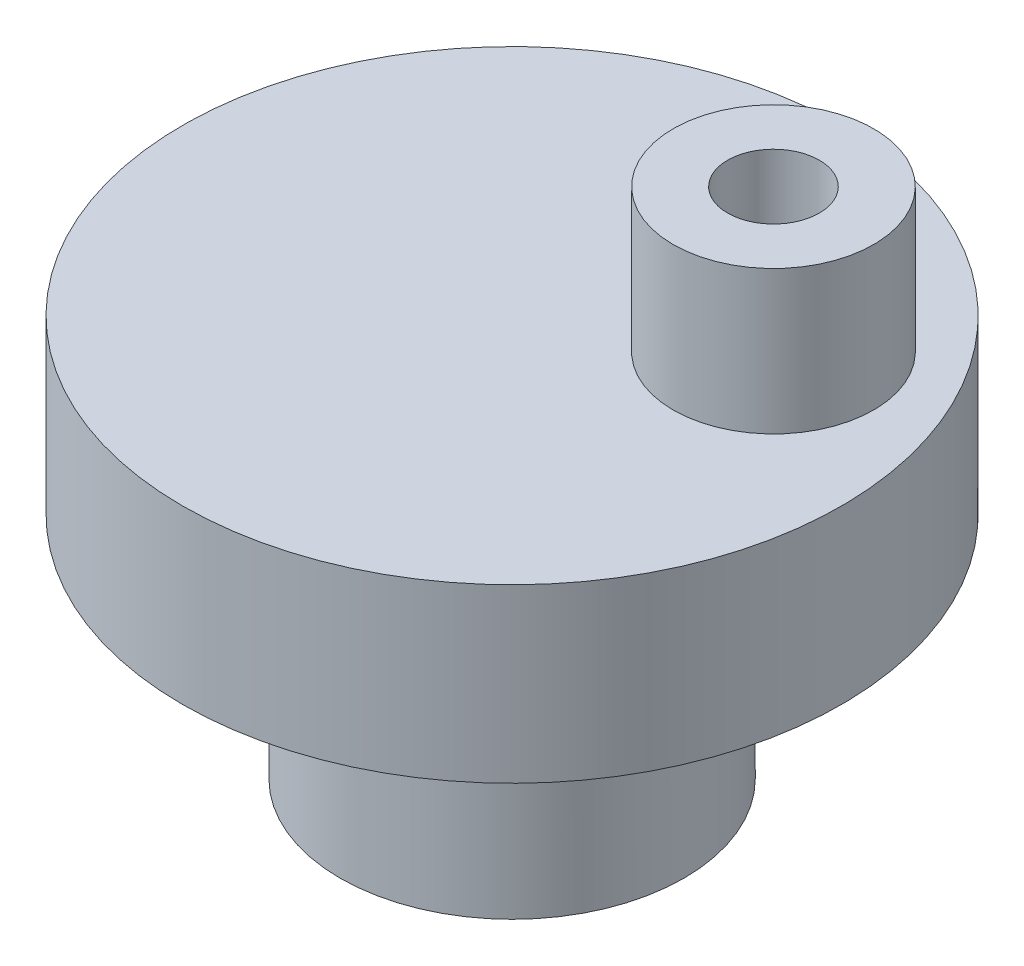
ISO-10303-21;
HEADER;
FILE_DESCRIPTION(('STEP AP214'),'2;1');
FILE_NAME('part.step','',(''),(''),'','','');
FILE_SCHEMA(('AUTOMOTIVE_DESIGN { 1 0 10303 214 1 1 1 1 }'));
ENDSEC;
DATA;
#1=APPLICATION_CONTEXT('core data for automotive mechanical design processes');
#2=APPLICATION_PROTOCOL_DEFINITION('international standard','automotive_design',2000,#1);
#3=PRODUCT_CONTEXT('',#1,'mechanical');
#4=PRODUCT('Part','Part','',(#3));
#5=PRODUCT_RELATED_PRODUCT_CATEGORY('part','',(#4));
#6=PRODUCT_DEFINITION_FORMATION('','',#4);
#7=PRODUCT_DEFINITION_CONTEXT('part definition',#1,'design');
#8=PRODUCT_DEFINITION('design','',#6,#7);
#9=PRODUCT_DEFINITION_SHAPE('','',#8);
#10=(LENGTH_UNIT() NAMED_UNIT(*) SI_UNIT(.MILLI.,.METRE.));
#11=(NAMED_UNIT(*) PLANE_ANGLE_UNIT() SI_UNIT($,.RADIAN.));
#12=(NAMED_UNIT(*) SI_UNIT($,.STERADIAN.) SOLID_ANGLE_UNIT());
#13=UNCERTAINTY_MEASURE_WITH_UNIT(LENGTH_MEASURE(1.E-05),#10,'distance_accuracy_value','');
#14=(GEOMETRIC_REPRESENTATION_CONTEXT(3) GLOBAL_UNCERTAINTY_ASSIGNED_CONTEXT((#13)) GLOBAL_UNIT_ASSIGNED_CONTEXT((#10,
#11,#12)) REPRESENTATION_CONTEXT('',''));
#15=CARTESIAN_POINT('',(0.,0.,0.));
#16=DIRECTION('',(0.,0.,1.));
#17=DIRECTION('',(1.,0.,0.));
#18=AXIS2_PLACEMENT_3D('',#15,#16,#17);
#19=CARTESIAN_POINT('',(0.,3.,0.));
#20=DIRECTION('',(0.,-1.,0.));
#21=DIRECTION('',(0.,0.,-1.));
#22=AXIS2_PLACEMENT_3D('',#19,#20,#21);
#23=CYLINDRICAL_SURFACE('',#22,1.5);
#24=DIRECTION('',(0.,1.,0.));
#25=VECTOR('',#24,1.);
#26=CARTESIAN_POINT('',(0.926753921266525,-4.,1.1794605416957));
#27=LINE('',#26,#25);
#28=CARTESIAN_POINT('',(0.926753921266524,-4.,1.1794605416957));
#29=VERTEX_POINT('',#28);
#30=CARTESIAN_POINT('',(0.926753921266525,2.2,1.1794605416957));
#31=VERTEX_POINT('',#30);
#32=EDGE_CURVE('E65',#29,#31,#27,.T.);
#33=ORIENTED_EDGE('',*,*,#32,.T.);
#34=CARTESIAN_POINT('',(0.,2.2,0.));
#35=DIRECTION('',(0.,1.,0.));
#36=DIRECTION('',(0.,0.,1.));
#37=AXIS2_PLACEMENT_3D('',#34,#35,#36);
#38=CIRCLE('',#37,1.5);
#39=CARTESIAN_POINT('',(-0.878196328439957,2.2,1.21604737108165));
#40=VERTEX_POINT('',#39);
#41=EDGE_CURVE('E48',#31,#40,#38,.T.);
#42=ORIENTED_EDGE('',*,*,#41,.T.);
#43=DIRECTION('',(0.,1.,0.));
#44=VECTOR('',#43,1.);
#45=CARTESIAN_POINT('',(-0.878196328439957,-4.,1.21604737108165));
#46=LINE('',#45,#44);
#47=CARTESIAN_POINT('',(-0.878196328439957,-4.,1.21604737108165));
#48=VERTEX_POINT('',#47);
#49=EDGE_CURVE('E63',#48,#40,#46,.T.);
#50=ORIENTED_EDGE('',*,*,#49,.F.);
#51=CARTESIAN_POINT('',(0.,-4.,0.));
#52=DIRECTION('',(0.,-1.,0.));
#53=DIRECTION('',(0.,0.,-1.));
#54=AXIS2_PLACEMENT_3D('',#51,#52,#53);
#55=CIRCLE('',#54,1.5);
#56=EDGE_CURVE('E55',#48,#29,#55,.T.);
#57=ORIENTED_EDGE('',*,*,#56,.T.);
#58=EDGE_LOOP('',(#33,#42,#50,#57));
#59=FACE_BOUND('',#58,.T.);
#60=ADVANCED_FACE('F34',(#59),#23,.F.);
#61=CARTESIAN_POINT('',(-0.878196328439957,-4.,1.21604737108165));
#62=DIRECTION('',(-0.0202661071897195,0.,-0.999794621359494));
#63=DIRECTION('',(-0.999794621359495,0.,0.0202661071897195));
#64=AXIS2_PLACEMENT_3D('',#61,#62,#63);
#65=PLANE('',#64);
#66=ORIENTED_EDGE('',*,*,#49,.T.);
#67=DIRECTION('',(0.999794621359495,0.,-0.0202661071897195));
#68=VECTOR('',#67,1.);
#69=CARTESIAN_POINT('',(-0.878196328439957,2.2,1.21604737108165));
#70=LINE('',#69,#68);
#71=EDGE_CURVE('E11',#40,#31,#70,.T.);
#72=ORIENTED_EDGE('',*,*,#71,.T.);
#73=ORIENTED_EDGE('',*,*,#32,.F.);
#74=DIRECTION('',(-0.999794621359494,0.,0.0202661071897195));
#75=VECTOR('',#74,1.);
#76=CARTESIAN_POINT('',(-0.878196328439957,-4.,1.21604737108165));
#77=LINE('',#76,#75);
#78=EDGE_CURVE('E70',#29,#48,#77,.T.);
#79=ORIENTED_EDGE('',*,*,#78,.T.);
#80=EDGE_LOOP('',(#66,#72,#73,#79));
#81=FACE_BOUND('',#80,.T.);
#82=ADVANCED_FACE('F68',(#81),#65,.T.);
#83=CARTESIAN_POINT('',(0.,0.,0.));
#84=DIRECTION('',(0.,1.,0.));
#85=DIRECTION('',(0.,0.,1.));
#86=AXIS2_PLACEMENT_3D('',#83,#84,#85);
#87=PLANE('',#86);
#88=CARTESIAN_POINT('',(0.,0.,0.));
#89=DIRECTION('',(0.,1.,0.));
#90=DIRECTION('',(0.,0.,1.));
#91=AXIS2_PLACEMENT_3D('',#88,#89,#90);
#92=CIRCLE('',#91,5.75);
#93=CARTESIAN_POINT('',(0.,0.,5.75));
#94=VERTEX_POINT('',#93);
#95=EDGE_CURVE('E80',#94,#94,#92,.T.);
#96=ORIENTED_EDGE('',*,*,#95,.F.);
#97=EDGE_LOOP('',(#96));
#98=FACE_BOUND('',#97,.T.);
#99=CARTESIAN_POINT('',(0.,0.,0.));
#100=DIRECTION('',(0.,1.,0.));
#101=DIRECTION('',(0.,0.,1.));
#102=AXIS2_PLACEMENT_3D('',#99,#100,#101);
#103=CIRCLE('',#102,3.);
#104=CARTESIAN_POINT('',(0.,0.,3.));
#105=VERTEX_POINT('',#104);
#106=EDGE_CURVE('E84',#105,#105,#103,.F.);
#107=ORIENTED_EDGE('',*,*,#106,.F.);
#108=EDGE_LOOP('',(#107));
#109=FACE_BOUND('',#108,.T.);
#110=ADVANCED_FACE('F107',(#98,#109),#87,.F.);
#111=CARTESIAN_POINT('',(0.,3.,0.));
#112=DIRECTION('',(0.,1.,0.));
#113=DIRECTION('',(0.,0.,1.));
#114=AXIS2_PLACEMENT_3D('',#111,#112,#113);
#115=PLANE('',#114);
#116=CARTESIAN_POINT('',(2.83060586950831,3.,-1.72945415326256));
#117=DIRECTION('',(0.,1.,0.));
#118=DIRECTION('',(0.,0.,1.));
#119=AXIS2_PLACEMENT_3D('',#116,#117,#118);
#120=CIRCLE('',#119,1.75);
#121=CARTESIAN_POINT('',(2.83060586950831,3.,0.0205458467374363));
#122=VERTEX_POINT('',#121);
#123=EDGE_CURVE('E137',#122,#122,#120,.T.);
#124=ORIENTED_EDGE('',*,*,#123,.F.);
#125=EDGE_LOOP('',(#124));
#126=FACE_BOUND('',#125,.T.);
#127=CARTESIAN_POINT('',(0.,3.,0.));
#128=DIRECTION('',(0.,1.,0.));
#129=DIRECTION('',(0.,0.,1.));
#130=AXIS2_PLACEMENT_3D('',#127,#128,#129);
#131=CIRCLE('',#130,5.75);
#132=CARTESIAN_POINT('',(0.,3.,5.75));
#133=VERTEX_POINT('',#132);
#134=EDGE_CURVE('E81',#133,#133,#131,.T.);
#135=ORIENTED_EDGE('',*,*,#134,.T.);
#136=EDGE_LOOP('',(#135));
#137=FACE_BOUND('',#136,.T.);
#138=ADVANCED_FACE('F96',(#126,#137),#115,.T.);
#139=CARTESIAN_POINT('',(0.,3.,0.));
#140=DIRECTION('',(0.,-1.,0.));
#141=DIRECTION('',(0.,0.,-1.));
#142=AXIS2_PLACEMENT_3D('',#139,#140,#141);
#143=CYLINDRICAL_SURFACE('',#142,5.75);
#144=ORIENTED_EDGE('',*,*,#134,.F.);
#145=EDGE_LOOP('',(#144));
#146=FACE_BOUND('',#145,.T.);
#147=ORIENTED_EDGE('',*,*,#95,.T.);
#148=EDGE_LOOP('',(#147));
#149=FACE_BOUND('',#148,.T.);
#150=ADVANCED_FACE('F36',(#146,#149),#143,.T.);
#151=CARTESIAN_POINT('',(0.,-4.,0.));
#152=DIRECTION('',(0.,-1.,0.));
#153=DIRECTION('',(0.,0.,-1.));
#154=AXIS2_PLACEMENT_3D('',#151,#152,#153);
#155=PLANE('',#154);
#156=CARTESIAN_POINT('',(0.,-4.,0.));
#157=DIRECTION('',(0.,-1.,0.));
#158=DIRECTION('',(0.,0.,-1.));
#159=AXIS2_PLACEMENT_3D('',#156,#157,#158);
#160=CIRCLE('',#159,3.);
#161=CARTESIAN_POINT('',(0.,-4.,-3.));
#162=VERTEX_POINT('',#161);
#163=EDGE_CURVE('E72',#162,#162,#160,.T.);
#164=ORIENTED_EDGE('',*,*,#163,.T.);
#165=EDGE_LOOP('',(#164));
#166=FACE_BOUND('',#165,.T.);
#167=ORIENTED_EDGE('',*,*,#56,.F.);
#168=ORIENTED_EDGE('',*,*,#78,.F.);
#169=EDGE_LOOP('',(#167,#168));
#170=FACE_BOUND('',#169,.T.);
#171=ADVANCED_FACE('F119',(#166,#170),#155,.T.);
#172=CARTESIAN_POINT('',(0.,-4.,0.));
#173=DIRECTION('',(0.,1.,0.));
#174=DIRECTION('',(0.,0.,1.));
#175=AXIS2_PLACEMENT_3D('',#172,#173,#174);
#176=CYLINDRICAL_SURFACE('',#175,3.);
#177=ORIENTED_EDGE('',*,*,#163,.F.);
#178=EDGE_LOOP('',(#177));
#179=FACE_BOUND('',#178,.T.);
#180=ORIENTED_EDGE('',*,*,#106,.T.);
#181=EDGE_LOOP('',(#180));
#182=FACE_BOUND('',#181,.T.);
#183=ADVANCED_FACE('F115',(#179,#182),#176,.T.);
#184=CARTESIAN_POINT('',(2.83060586950831,5.5,-1.72945415326256));
#185=DIRECTION('',(0.,1.,0.));
#186=DIRECTION('',(0.,0.,1.));
#187=AXIS2_PLACEMENT_3D('',#184,#185,#186);
#188=PLANE('',#187);
#189=CARTESIAN_POINT('',(2.83060586950831,5.5,-1.72945415326256));
#190=DIRECTION('',(0.,1.,0.));
#191=DIRECTION('',(0.,0.,1.));
#192=AXIS2_PLACEMENT_3D('',#189,#190,#191);
#193=CIRCLE('',#192,1.75);
#194=CARTESIAN_POINT('',(2.83060586950831,5.5,0.0205458467374363));
#195=VERTEX_POINT('',#194);
#196=EDGE_CURVE('E134',#195,#195,#193,.T.);
#197=ORIENTED_EDGE('',*,*,#196,.T.);
#198=EDGE_LOOP('',(#197));
#199=FACE_BOUND('',#198,.T.);
#200=CARTESIAN_POINT('',(2.83060586950831,5.5,-1.72945415326256));
#201=DIRECTION('',(0.,1.,0.));
#202=DIRECTION('',(0.,0.,1.));
#203=AXIS2_PLACEMENT_3D('',#200,#201,#202);
#204=CIRCLE('',#203,0.8);
#205=CARTESIAN_POINT('',(2.83060586950831,5.5,-0.929454153262564));
#206=VERTEX_POINT('',#205);
#207=EDGE_CURVE('E66',#206,#206,#204,.T.);
#208=ORIENTED_EDGE('',*,*,#207,.F.);
#209=EDGE_LOOP('',(#208));
#210=FACE_BOUND('',#209,.T.);
#211=ADVANCED_FACE('F118',(#199,#210),#188,.T.);
#212=CARTESIAN_POINT('',(2.83060586950831,5.5,-1.72945415326256));
#213=DIRECTION('',(0.,-1.,0.));
#214=DIRECTION('',(0.,0.,-1.));
#215=AXIS2_PLACEMENT_3D('',#212,#213,#214);
#216=CYLINDRICAL_SURFACE('',#215,1.75);
#217=ORIENTED_EDGE('',*,*,#196,.F.);
#218=EDGE_LOOP('',(#217));
#219=FACE_BOUND('',#218,.T.);
#220=ORIENTED_EDGE('',*,*,#123,.T.);
#221=EDGE_LOOP('',(#220));
#222=FACE_BOUND('',#221,.T.);
#223=ADVANCED_FACE('F102',(#219,#222),#216,.T.);
#224=CARTESIAN_POINT('',(2.83060586950831,5.5,-1.72945415326256));
#225=DIRECTION('',(0.,-1.,0.));
#226=DIRECTION('',(0.,0.,-1.));
#227=AXIS2_PLACEMENT_3D('',#224,#225,#226);
#228=CYLINDRICAL_SURFACE('',#227,0.8);
#229=ORIENTED_EDGE('',*,*,#207,.T.);
#230=EDGE_LOOP('',(#229));
#231=FACE_BOUND('',#230,.T.);
#232=CARTESIAN_POINT('',(2.83060586950831,3.,-1.72945415326256));
#233=DIRECTION('',(0.,1.,0.));
#234=DIRECTION('',(0.,0.,1.));
#235=AXIS2_PLACEMENT_3D('',#232,#233,#234);
#236=CIRCLE('',#235,0.8);
#237=CARTESIAN_POINT('',(2.83060586950831,3.,-0.929454153262564));
#238=VERTEX_POINT('',#237);
#239=EDGE_CURVE('E42',#238,#238,#236,.F.);
#240=ORIENTED_EDGE('',*,*,#239,.T.);
#241=EDGE_LOOP('',(#240));
#242=FACE_BOUND('',#241,.T.);
#243=ADVANCED_FACE('F91',(#231,#242),#228,.F.);
#244=ORIENTED_EDGE('',*,*,#239,.F.);
#245=EDGE_LOOP('',(#244));
#246=FACE_BOUND('',#245,.T.);
#247=ADVANCED_FACE('F93',(#246),#115,.T.);
#248=CARTESIAN_POINT('',(0.,2.2,0.));
#249=DIRECTION('',(0.,1.,0.));
#250=DIRECTION('',(0.,0.,1.));
#251=AXIS2_PLACEMENT_3D('',#248,#249,#250);
#252=PLANE('',#251);
#253=ORIENTED_EDGE('',*,*,#41,.F.);
#254=ORIENTED_EDGE('',*,*,#71,.F.);
#255=EDGE_LOOP('',(#253,#254));
#256=FACE_BOUND('',#255,.T.);
#257=ADVANCED_FACE('F60',(#256),#252,.F.);
#258=CLOSED_SHELL('',(#60,#82,#110,#138,#150,#171,#183,#211,#223,#243,#247,#257));
#259=MANIFOLD_SOLID_BREP('B2',#258);
#260=ADVANCED_BREP_SHAPE_REPRESENTATION('',(#18,#259),#14);
#261=SHAPE_DEFINITION_REPRESENTATION(#9,#260);
ENDSEC;
END-ISO-10303-21;
